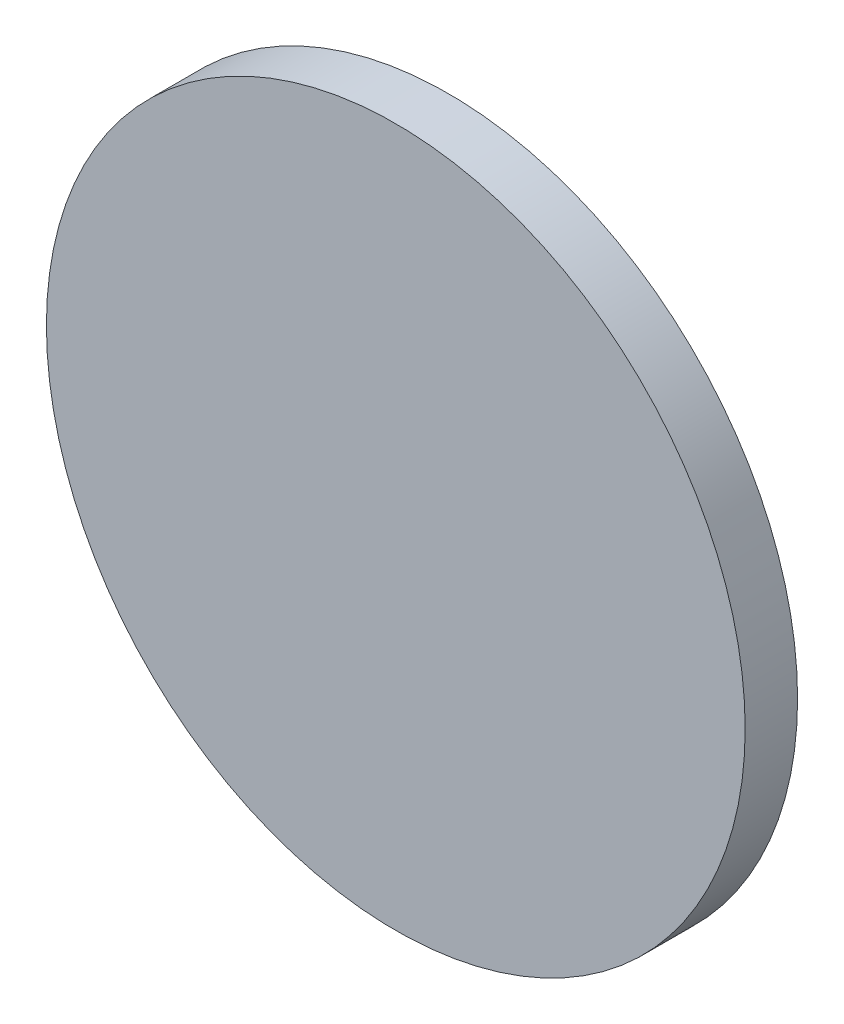
ISO-10303-21;
HEADER;
FILE_DESCRIPTION(('STEP AP214'),'2;1');
FILE_NAME('part.step','',(''),(''),'','','');
FILE_SCHEMA(('AUTOMOTIVE_DESIGN { 1 0 10303 214 1 1 1 1 }'));
ENDSEC;
DATA;
#1=APPLICATION_CONTEXT('core data for automotive mechanical design processes');
#2=APPLICATION_PROTOCOL_DEFINITION('international standard','automotive_design',2000,#1);
#3=PRODUCT_CONTEXT('',#1,'mechanical');
#4=PRODUCT('Part','Part','',(#3));
#5=PRODUCT_RELATED_PRODUCT_CATEGORY('part','',(#4));
#6=PRODUCT_DEFINITION_FORMATION('','',#4);
#7=PRODUCT_DEFINITION_CONTEXT('part definition',#1,'design');
#8=PRODUCT_DEFINITION('design','',#6,#7);
#9=PRODUCT_DEFINITION_SHAPE('','',#8);
#10=(LENGTH_UNIT() NAMED_UNIT(*) SI_UNIT(.MILLI.,.METRE.));
#11=(NAMED_UNIT(*) PLANE_ANGLE_UNIT() SI_UNIT($,.RADIAN.));
#12=(NAMED_UNIT(*) SI_UNIT($,.STERADIAN.) SOLID_ANGLE_UNIT());
#13=UNCERTAINTY_MEASURE_WITH_UNIT(LENGTH_MEASURE(1.E-05),#10,'distance_accuracy_value','');
#14=(GEOMETRIC_REPRESENTATION_CONTEXT(3) GLOBAL_UNCERTAINTY_ASSIGNED_CONTEXT((#13)) GLOBAL_UNIT_ASSIGNED_CONTEXT((#10,
#11,#12)) REPRESENTATION_CONTEXT('',''));
#15=CARTESIAN_POINT('',(0.,0.,0.));
#16=DIRECTION('',(0.,0.,1.));
#17=DIRECTION('',(1.,0.,0.));
#18=AXIS2_PLACEMENT_3D('',#15,#16,#17);
#19=CARTESIAN_POINT('',(0.,0.,15.));
#20=DIRECTION('',(0.,0.,-1.));
#21=DIRECTION('',(-1.,0.,0.));
#22=AXIS2_PLACEMENT_3D('',#19,#20,#21);
#23=CYLINDRICAL_SURFACE('',#22,100.);
#24=CARTESIAN_POINT('',(0.,0.,15.));
#25=DIRECTION('',(0.,0.,1.));
#26=DIRECTION('',(1.,0.,0.));
#27=AXIS2_PLACEMENT_3D('',#24,#25,#26);
#28=CIRCLE('',#27,100.);
#29=CARTESIAN_POINT('',(100.,0.,15.));
#30=VERTEX_POINT('',#29);
#31=EDGE_CURVE('E10',#30,#30,#28,.T.);
#32=ORIENTED_EDGE('',*,*,#31,.F.);
#33=EDGE_LOOP('',(#32));
#34=FACE_BOUND('',#33,.T.);
#35=CARTESIAN_POINT('',(0.,0.,0.));
#36=DIRECTION('',(0.,0.,1.));
#37=DIRECTION('',(1.,0.,0.));
#38=AXIS2_PLACEMENT_3D('',#35,#36,#37);
#39=CIRCLE('',#38,100.);
#40=CARTESIAN_POINT('',(100.,0.,0.));
#41=VERTEX_POINT('',#40);
#42=EDGE_CURVE('E34',#41,#41,#39,.T.);
#43=ORIENTED_EDGE('',*,*,#42,.T.);
#44=EDGE_LOOP('',(#43));
#45=FACE_BOUND('',#44,.T.);
#46=ADVANCED_FACE('F31',(#34,#45),#23,.T.);
#47=CARTESIAN_POINT('',(0.,0.,15.));
#48=DIRECTION('',(0.,0.,1.));
#49=DIRECTION('',(1.,0.,0.));
#50=AXIS2_PLACEMENT_3D('',#47,#48,#49);
#51=PLANE('',#50);
#52=ORIENTED_EDGE('',*,*,#31,.T.);
#53=EDGE_LOOP('',(#52));
#54=FACE_BOUND('',#53,.T.);
#55=ADVANCED_FACE('F46',(#54),#51,.T.);
#56=CARTESIAN_POINT('',(0.,0.,0.));
#57=DIRECTION('',(0.,0.,1.));
#58=DIRECTION('',(1.,0.,0.));
#59=AXIS2_PLACEMENT_3D('',#56,#57,#58);
#60=PLANE('',#59);
#61=ORIENTED_EDGE('',*,*,#42,.F.);
#62=EDGE_LOOP('',(#61));
#63=FACE_BOUND('',#62,.T.);
#64=ADVANCED_FACE('F44',(#63),#60,.F.);
#65=CLOSED_SHELL('',(#46,#55,#64));
#66=MANIFOLD_SOLID_BREP('B2',#65);
#67=ADVANCED_BREP_SHAPE_REPRESENTATION('',(#18,#66),#14);
#68=SHAPE_DEFINITION_REPRESENTATION(#9,#67);
ENDSEC;
END-ISO-10303-21;
